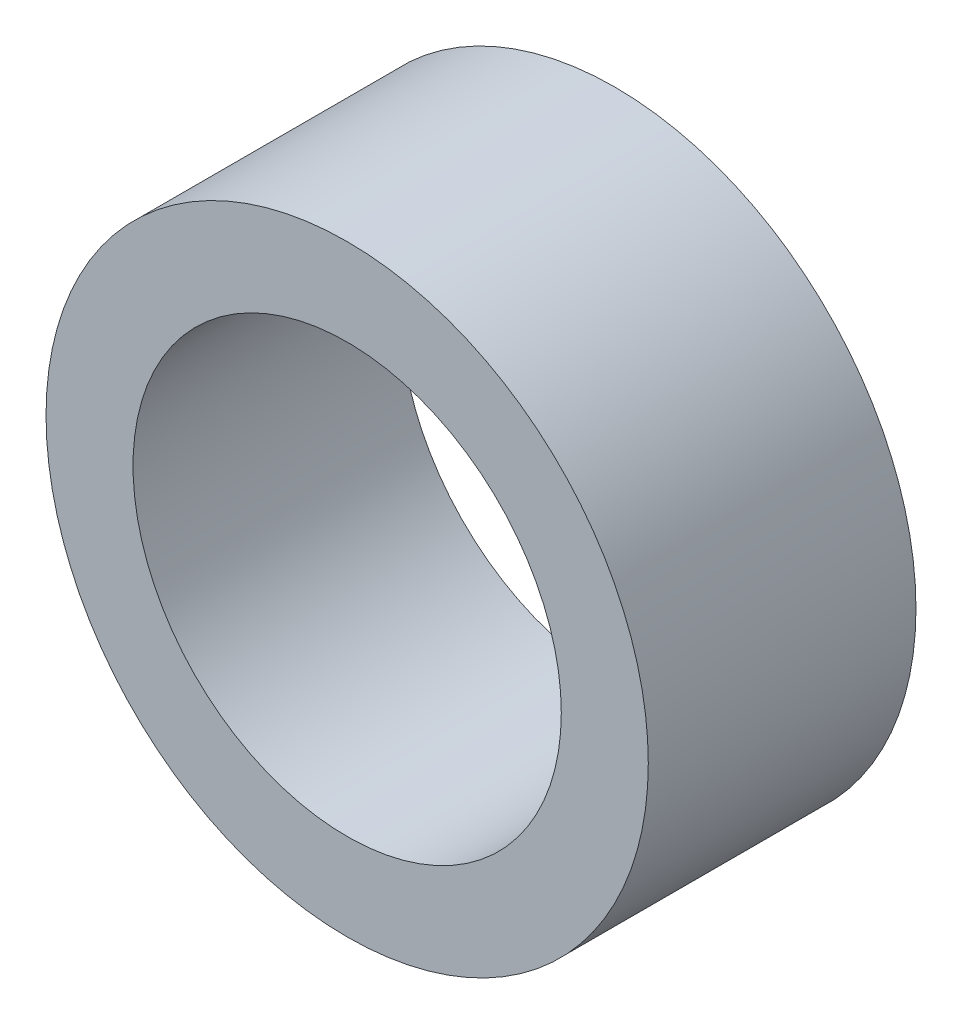
ISO-10303-21;
HEADER;
FILE_DESCRIPTION(('STEP AP214'),'2;1');
FILE_NAME('part.step','',(''),(''),'','','');
FILE_SCHEMA(('AUTOMOTIVE_DESIGN { 1 0 10303 214 1 1 1 1 }'));
ENDSEC;
DATA;
#1=APPLICATION_CONTEXT('core data for automotive mechanical design processes');
#2=APPLICATION_PROTOCOL_DEFINITION('international standard','automotive_design',2000,#1);
#3=PRODUCT_CONTEXT('',#1,'mechanical');
#4=PRODUCT('Part','Part','',(#3));
#5=PRODUCT_RELATED_PRODUCT_CATEGORY('part','',(#4));
#6=PRODUCT_DEFINITION_FORMATION('','',#4);
#7=PRODUCT_DEFINITION_CONTEXT('part definition',#1,'design');
#8=PRODUCT_DEFINITION('design','',#6,#7);
#9=PRODUCT_DEFINITION_SHAPE('','',#8);
#10=(LENGTH_UNIT() NAMED_UNIT(*) SI_UNIT(.MILLI.,.METRE.));
#11=(NAMED_UNIT(*) PLANE_ANGLE_UNIT() SI_UNIT($,.RADIAN.));
#12=(NAMED_UNIT(*) SI_UNIT($,.STERADIAN.) SOLID_ANGLE_UNIT());
#13=UNCERTAINTY_MEASURE_WITH_UNIT(LENGTH_MEASURE(1.E-05),#10,'distance_accuracy_value','');
#14=(GEOMETRIC_REPRESENTATION_CONTEXT(3) GLOBAL_UNCERTAINTY_ASSIGNED_CONTEXT((#13)) GLOBAL_UNIT_ASSIGNED_CONTEXT((#10,
#11,#12)) REPRESENTATION_CONTEXT('',''));
#15=CARTESIAN_POINT('',(0.,0.,0.));
#16=DIRECTION('',(0.,0.,1.));
#17=DIRECTION('',(1.,0.,0.));
#18=AXIS2_PLACEMENT_3D('',#15,#16,#17);
#19=CARTESIAN_POINT('',(0.,0.,1.));
#20=DIRECTION('',(0.,0.,1.));
#21=DIRECTION('',(1.,0.,0.));
#22=AXIS2_PLACEMENT_3D('',#19,#20,#21);
#23=PLANE('',#22);
#24=CARTESIAN_POINT('',(0.,0.,1.));
#25=DIRECTION('',(0.,0.,1.));
#26=DIRECTION('',(1.,0.,0.));
#27=AXIS2_PLACEMENT_3D('',#24,#25,#26);
#28=CIRCLE('',#27,2.25);
#29=CARTESIAN_POINT('',(2.25,0.,1.));
#30=VERTEX_POINT('',#29);
#31=EDGE_CURVE('E10',#30,#30,#28,.T.);
#32=ORIENTED_EDGE('',*,*,#31,.T.);
#33=EDGE_LOOP('',(#32));
#34=FACE_BOUND('',#33,.T.);
#35=CARTESIAN_POINT('',(0.,0.,1.));
#36=DIRECTION('',(0.,0.,1.));
#37=DIRECTION('',(1.,0.,0.));
#38=AXIS2_PLACEMENT_3D('',#35,#36,#37);
#39=CIRCLE('',#38,1.6);
#40=CARTESIAN_POINT('',(1.6,0.,1.));
#41=VERTEX_POINT('',#40);
#42=EDGE_CURVE('E43',#41,#41,#39,.T.);
#43=ORIENTED_EDGE('',*,*,#42,.F.);
#44=EDGE_LOOP('',(#43));
#45=FACE_BOUND('',#44,.T.);
#46=ADVANCED_FACE('F32',(#34,#45),#23,.T.);
#47=CARTESIAN_POINT('',(0.,0.,-1.));
#48=DIRECTION('',(0.,0.,1.));
#49=DIRECTION('',(1.,0.,0.));
#50=AXIS2_PLACEMENT_3D('',#47,#48,#49);
#51=PLANE('',#50);
#52=CARTESIAN_POINT('',(0.,0.,-1.));
#53=DIRECTION('',(0.,0.,1.));
#54=DIRECTION('',(1.,0.,0.));
#55=AXIS2_PLACEMENT_3D('',#52,#53,#54);
#56=CIRCLE('',#55,2.25);
#57=CARTESIAN_POINT('',(2.25,0.,-1.));
#58=VERTEX_POINT('',#57);
#59=EDGE_CURVE('E36',#58,#58,#56,.T.);
#60=ORIENTED_EDGE('',*,*,#59,.F.);
#61=EDGE_LOOP('',(#60));
#62=FACE_BOUND('',#61,.T.);
#63=CARTESIAN_POINT('',(0.,0.,-1.));
#64=DIRECTION('',(0.,0.,1.));
#65=DIRECTION('',(1.,0.,0.));
#66=AXIS2_PLACEMENT_3D('',#63,#64,#65);
#67=CIRCLE('',#66,1.6);
#68=CARTESIAN_POINT('',(1.6,0.,-1.));
#69=VERTEX_POINT('',#68);
#70=EDGE_CURVE('E45',#69,#69,#67,.T.);
#71=ORIENTED_EDGE('',*,*,#70,.T.);
#72=EDGE_LOOP('',(#71));
#73=FACE_BOUND('',#72,.T.);
#74=ADVANCED_FACE('F55',(#62,#73),#51,.F.);
#75=CARTESIAN_POINT('',(0.,0.,1.));
#76=DIRECTION('',(0.,0.,-1.));
#77=DIRECTION('',(-1.,0.,0.));
#78=AXIS2_PLACEMENT_3D('',#75,#76,#77);
#79=CYLINDRICAL_SURFACE('',#78,2.25);
#80=ORIENTED_EDGE('',*,*,#31,.F.);
#81=EDGE_LOOP('',(#80));
#82=FACE_BOUND('',#81,.T.);
#83=ORIENTED_EDGE('',*,*,#59,.T.);
#84=EDGE_LOOP('',(#83));
#85=FACE_BOUND('',#84,.T.);
#86=ADVANCED_FACE('F34',(#82,#85),#79,.T.);
#87=CARTESIAN_POINT('',(0.,0.,1.));
#88=DIRECTION('',(0.,0.,-1.));
#89=DIRECTION('',(-1.,0.,0.));
#90=AXIS2_PLACEMENT_3D('',#87,#88,#89);
#91=CYLINDRICAL_SURFACE('',#90,1.6);
#92=ORIENTED_EDGE('',*,*,#42,.T.);
#93=EDGE_LOOP('',(#92));
#94=FACE_BOUND('',#93,.T.);
#95=ORIENTED_EDGE('',*,*,#70,.F.);
#96=EDGE_LOOP('',(#95));
#97=FACE_BOUND('',#96,.T.);
#98=ADVANCED_FACE('F51',(#94,#97),#91,.F.);
#99=CLOSED_SHELL('',(#46,#74,#86,#98));
#100=MANIFOLD_SOLID_BREP('B2',#99);
#101=ADVANCED_BREP_SHAPE_REPRESENTATION('',(#18,#100),#14);
#102=SHAPE_DEFINITION_REPRESENTATION(#9,#101);
ENDSEC;
END-ISO-10303-21;
